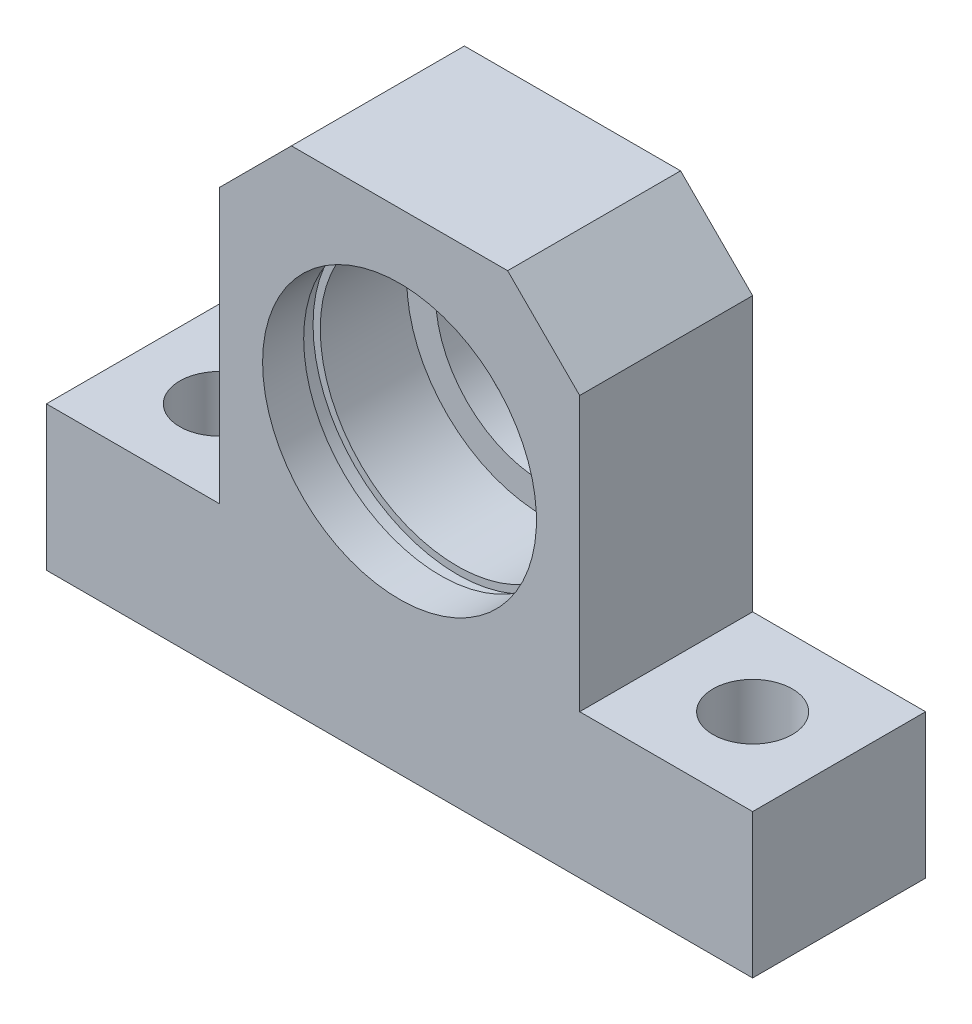
ISO-10303-21;
HEADER;
FILE_DESCRIPTION(('STEP AP214'),'2;1');
FILE_NAME('part.step','',(''),(''),'','','');
FILE_SCHEMA(('AUTOMOTIVE_DESIGN { 1 0 10303 214 1 1 1 1 }'));
ENDSEC;
DATA;
#1=APPLICATION_CONTEXT('core data for automotive mechanical design processes');
#2=APPLICATION_PROTOCOL_DEFINITION('international standard','automotive_design',2000,#1);
#3=PRODUCT_CONTEXT('',#1,'mechanical');
#4=PRODUCT('Part','Part','',(#3));
#5=PRODUCT_RELATED_PRODUCT_CATEGORY('part','',(#4));
#6=PRODUCT_DEFINITION_FORMATION('','',#4);
#7=PRODUCT_DEFINITION_CONTEXT('part definition',#1,'design');
#8=PRODUCT_DEFINITION('design','',#6,#7);
#9=PRODUCT_DEFINITION_SHAPE('','',#8);
#10=(LENGTH_UNIT() NAMED_UNIT(*) SI_UNIT(.MILLI.,.METRE.));
#11=(NAMED_UNIT(*) PLANE_ANGLE_UNIT() SI_UNIT($,.RADIAN.));
#12=(NAMED_UNIT(*) SI_UNIT($,.STERADIAN.) SOLID_ANGLE_UNIT());
#13=UNCERTAINTY_MEASURE_WITH_UNIT(LENGTH_MEASURE(1.E-05),#10,'distance_accuracy_value','');
#14=(GEOMETRIC_REPRESENTATION_CONTEXT(3) GLOBAL_UNCERTAINTY_ASSIGNED_CONTEXT((#13)) GLOBAL_UNIT_ASSIGNED_CONTEXT((#10,
#11,#12)) REPRESENTATION_CONTEXT('',''));
#15=CARTESIAN_POINT('',(0.,0.,0.));
#16=DIRECTION('',(0.,0.,1.));
#17=DIRECTION('',(1.,0.,0.));
#18=AXIS2_PLACEMENT_3D('',#15,#16,#17);
#19=CARTESIAN_POINT('',(-12.5,9.99999999999999,-12.));
#20=DIRECTION('',(-1.,0.,0.));
#21=DIRECTION('',(0.,-1.,0.));
#22=AXIS2_PLACEMENT_3D('',#19,#20,#21);
#23=PLANE('',#22);
#24=DIRECTION('',(0.,-1.,0.));
#25=VECTOR('',#24,1.);
#26=CARTESIAN_POINT('',(-12.5,9.99999999999999,0.));
#27=LINE('',#26,#25);
#28=CARTESIAN_POINT('',(-12.5,29.,0.));
#29=VERTEX_POINT('',#28);
#30=CARTESIAN_POINT('',(-12.5,9.99999999999999,0.));
#31=VERTEX_POINT('',#30);
#32=EDGE_CURVE('E147',#29,#31,#27,.T.);
#33=ORIENTED_EDGE('',*,*,#32,.F.);
#34=DIRECTION('',(0.,0.,-1.));
#35=VECTOR('',#34,1.);
#36=CARTESIAN_POINT('',(-12.5,29.,-12.));
#37=LINE('',#36,#35);
#38=CARTESIAN_POINT('',(-12.5,29.,-12.));
#39=VERTEX_POINT('',#38);
#40=EDGE_CURVE('E11',#29,#39,#37,.T.);
#41=ORIENTED_EDGE('',*,*,#40,.T.);
#42=DIRECTION('',(0.,-1.,0.));
#43=VECTOR('',#42,1.);
#44=CARTESIAN_POINT('',(-12.5,9.99999999999999,-12.));
#45=LINE('',#44,#43);
#46=CARTESIAN_POINT('',(-12.5,9.99999999999999,-12.));
#47=VERTEX_POINT('',#46);
#48=EDGE_CURVE('E109',#39,#47,#45,.T.);
#49=ORIENTED_EDGE('',*,*,#48,.T.);
#50=DIRECTION('',(0.,0.,1.));
#51=VECTOR('',#50,1.);
#52=CARTESIAN_POINT('',(-12.5,9.99999999999999,-12.));
#53=LINE('',#52,#51);
#54=EDGE_CURVE('E111',#47,#31,#53,.T.);
#55=ORIENTED_EDGE('',*,*,#54,.T.);
#56=EDGE_LOOP('',(#33,#41,#49,#55));
#57=FACE_BOUND('',#56,.T.);
#58=ADVANCED_FACE('F34',(#57),#23,.T.);
#59=CARTESIAN_POINT('',(-12.5,34.,-12.));
#60=DIRECTION('',(0.,1.,0.));
#61=DIRECTION('',(0.,0.,1.));
#62=AXIS2_PLACEMENT_3D('',#59,#60,#61);
#63=PLANE('',#62);
#64=DIRECTION('',(-1.,0.,0.));
#65=VECTOR('',#64,1.);
#66=CARTESIAN_POINT('',(-12.5,34.,0.));
#67=LINE('',#66,#65);
#68=CARTESIAN_POINT('',(7.49999999999997,34.,0.));
#69=VERTEX_POINT('',#68);
#70=CARTESIAN_POINT('',(-7.5,34.,0.));
#71=VERTEX_POINT('',#70);
#72=EDGE_CURVE('E115',#69,#71,#67,.T.);
#73=ORIENTED_EDGE('',*,*,#72,.F.);
#74=DIRECTION('',(0.,0.,-1.));
#75=VECTOR('',#74,1.);
#76=CARTESIAN_POINT('',(7.49999999999997,34.,-12.));
#77=LINE('',#76,#75);
#78=CARTESIAN_POINT('',(7.49999999999997,34.,-12.));
#79=VERTEX_POINT('',#78);
#80=EDGE_CURVE('E187',#69,#79,#77,.T.);
#81=ORIENTED_EDGE('',*,*,#80,.T.);
#82=DIRECTION('',(-1.,0.,0.));
#83=VECTOR('',#82,1.);
#84=CARTESIAN_POINT('',(-12.5,34.,-12.));
#85=LINE('',#84,#83);
#86=CARTESIAN_POINT('',(-7.50000000000001,34.,-12.));
#87=VERTEX_POINT('',#86);
#88=EDGE_CURVE('E123',#79,#87,#85,.T.);
#89=ORIENTED_EDGE('',*,*,#88,.T.);
#90=DIRECTION('',(0.,0.,1.));
#91=VECTOR('',#90,1.);
#92=CARTESIAN_POINT('',(-7.5,34.,-12.));
#93=LINE('',#92,#91);
#94=EDGE_CURVE('E184',#87,#71,#93,.T.);
#95=ORIENTED_EDGE('',*,*,#94,.T.);
#96=EDGE_LOOP('',(#73,#81,#89,#95));
#97=FACE_BOUND('',#96,.T.);
#98=ADVANCED_FACE('F203',(#97),#63,.T.);
#99=CARTESIAN_POINT('',(12.5,34.,-12.));
#100=DIRECTION('',(1.,0.,0.));
#101=DIRECTION('',(0.,1.,0.));
#102=AXIS2_PLACEMENT_3D('',#99,#100,#101);
#103=PLANE('',#102);
#104=DIRECTION('',(0.,1.,0.));
#105=VECTOR('',#104,1.);
#106=CARTESIAN_POINT('',(12.5,34.,-12.));
#107=LINE('',#106,#105);
#108=CARTESIAN_POINT('',(12.5,10.,-12.));
#109=VERTEX_POINT('',#108);
#110=CARTESIAN_POINT('',(12.5,29.,-12.));
#111=VERTEX_POINT('',#110);
#112=EDGE_CURVE('E143',#109,#111,#107,.T.);
#113=ORIENTED_EDGE('',*,*,#112,.T.);
#114=DIRECTION('',(0.,0.,1.));
#115=VECTOR('',#114,1.);
#116=CARTESIAN_POINT('',(12.5,29.,-12.));
#117=LINE('',#116,#115);
#118=CARTESIAN_POINT('',(12.5,29.,0.));
#119=VERTEX_POINT('',#118);
#120=EDGE_CURVE('E170',#111,#119,#117,.T.);
#121=ORIENTED_EDGE('',*,*,#120,.T.);
#122=DIRECTION('',(0.,1.,0.));
#123=VECTOR('',#122,1.);
#124=CARTESIAN_POINT('',(12.5,34.,0.));
#125=LINE('',#124,#123);
#126=CARTESIAN_POINT('',(12.5,10.,0.));
#127=VERTEX_POINT('',#126);
#128=EDGE_CURVE('E163',#127,#119,#125,.T.);
#129=ORIENTED_EDGE('',*,*,#128,.F.);
#130=DIRECTION('',(0.,0.,1.));
#131=VECTOR('',#130,1.);
#132=CARTESIAN_POINT('',(12.5,10.,-12.));
#133=LINE('',#132,#131);
#134=EDGE_CURVE('E168',#109,#127,#133,.T.);
#135=ORIENTED_EDGE('',*,*,#134,.F.);
#136=EDGE_LOOP('',(#113,#121,#129,#135));
#137=FACE_BOUND('',#136,.T.);
#138=ADVANCED_FACE('F196',(#137),#103,.T.);
#139=CARTESIAN_POINT('',(12.5,10.,-12.));
#140=DIRECTION('',(0.,1.,0.));
#141=DIRECTION('',(-1.,0.,0.));
#142=AXIS2_PLACEMENT_3D('',#139,#140,#141);
#143=PLANE('',#142);
#144=CARTESIAN_POINT('',(18.5,10.,-6.));
#145=DIRECTION('',(0.,1.,0.));
#146=DIRECTION('',(0.,0.,1.));
#147=AXIS2_PLACEMENT_3D('',#144,#145,#146);
#148=CIRCLE('',#147,2.74999999999999);
#149=CARTESIAN_POINT('',(18.5,10.,-3.25000000000001));
#150=VERTEX_POINT('',#149);
#151=EDGE_CURVE('E316',#150,#150,#148,.T.);
#152=ORIENTED_EDGE('',*,*,#151,.F.);
#153=EDGE_LOOP('',(#152));
#154=FACE_BOUND('',#153,.T.);
#155=DIRECTION('',(-1.,0.,0.));
#156=VECTOR('',#155,1.);
#157=CARTESIAN_POINT('',(12.5,10.,0.));
#158=LINE('',#157,#156);
#159=CARTESIAN_POINT('',(24.5,9.99999999999999,0.));
#160=VERTEX_POINT('',#159);
#161=EDGE_CURVE('E160',#160,#127,#158,.T.);
#162=ORIENTED_EDGE('',*,*,#161,.F.);
#163=DIRECTION('',(0.,0.,1.));
#164=VECTOR('',#163,1.);
#165=CARTESIAN_POINT('',(24.5,9.99999999999999,-12.));
#166=LINE('',#165,#164);
#167=CARTESIAN_POINT('',(24.5,9.99999999999999,-12.));
#168=VERTEX_POINT('',#167);
#169=EDGE_CURVE('E171',#168,#160,#166,.T.);
#170=ORIENTED_EDGE('',*,*,#169,.F.);
#171=DIRECTION('',(-1.,0.,0.));
#172=VECTOR('',#171,1.);
#173=CARTESIAN_POINT('',(12.5,10.,-12.));
#174=LINE('',#173,#172);
#175=EDGE_CURVE('E140',#168,#109,#174,.T.);
#176=ORIENTED_EDGE('',*,*,#175,.T.);
#177=ORIENTED_EDGE('',*,*,#134,.T.);
#178=EDGE_LOOP('',(#162,#170,#176,#177));
#179=FACE_BOUND('',#178,.T.);
#180=ADVANCED_FACE('F218',(#154,#179),#143,.T.);
#181=CARTESIAN_POINT('',(24.5,9.99999999999999,-12.));
#182=DIRECTION('',(1.,0.,0.));
#183=DIRECTION('',(0.,0.,-1.));
#184=AXIS2_PLACEMENT_3D('',#181,#182,#183);
#185=PLANE('',#184);
#186=DIRECTION('',(0.,1.,0.));
#187=VECTOR('',#186,1.);
#188=CARTESIAN_POINT('',(24.5,9.99999999999999,0.));
#189=LINE('',#188,#187);
#190=CARTESIAN_POINT('',(24.5,0.,0.));
#191=VERTEX_POINT('',#190);
#192=EDGE_CURVE('E157',#191,#160,#189,.T.);
#193=ORIENTED_EDGE('',*,*,#192,.F.);
#194=DIRECTION('',(0.,0.,1.));
#195=VECTOR('',#194,1.);
#196=CARTESIAN_POINT('',(24.5,0.,-12.));
#197=LINE('',#196,#195);
#198=CARTESIAN_POINT('',(24.5,0.,-12.));
#199=VERTEX_POINT('',#198);
#200=EDGE_CURVE('E173',#199,#191,#197,.T.);
#201=ORIENTED_EDGE('',*,*,#200,.F.);
#202=DIRECTION('',(0.,1.,0.));
#203=VECTOR('',#202,1.);
#204=CARTESIAN_POINT('',(24.5,9.99999999999999,-12.));
#205=LINE('',#204,#203);
#206=EDGE_CURVE('E137',#199,#168,#205,.T.);
#207=ORIENTED_EDGE('',*,*,#206,.T.);
#208=ORIENTED_EDGE('',*,*,#169,.T.);
#209=EDGE_LOOP('',(#193,#201,#207,#208));
#210=FACE_BOUND('',#209,.T.);
#211=ADVANCED_FACE('F215',(#210),#185,.T.);
#212=CARTESIAN_POINT('',(24.5,0.,-12.));
#213=DIRECTION('',(0.,-1.,0.));
#214=DIRECTION('',(0.,0.,-1.));
#215=AXIS2_PLACEMENT_3D('',#212,#213,#214);
#216=PLANE('',#215);
#217=CARTESIAN_POINT('',(-18.5,0.,-6.));
#218=DIRECTION('',(0.,1.,0.));
#219=DIRECTION('',(0.,0.,1.));
#220=AXIS2_PLACEMENT_3D('',#217,#218,#219);
#221=CIRCLE('',#220,2.75);
#222=CARTESIAN_POINT('',(-18.5,0.,-3.25));
#223=VERTEX_POINT('',#222);
#224=EDGE_CURVE('E319',#223,#223,#221,.T.);
#225=ORIENTED_EDGE('',*,*,#224,.T.);
#226=EDGE_LOOP('',(#225));
#227=FACE_BOUND('',#226,.T.);
#228=CARTESIAN_POINT('',(18.5,0.,-6.));
#229=DIRECTION('',(0.,1.,0.));
#230=DIRECTION('',(0.,0.,1.));
#231=AXIS2_PLACEMENT_3D('',#228,#229,#230);
#232=CIRCLE('',#231,2.75);
#233=CARTESIAN_POINT('',(18.5,0.,-3.25));
#234=VERTEX_POINT('',#233);
#235=EDGE_CURVE('E313',#234,#234,#232,.T.);
#236=ORIENTED_EDGE('',*,*,#235,.T.);
#237=EDGE_LOOP('',(#236));
#238=FACE_BOUND('',#237,.T.);
#239=DIRECTION('',(1.,0.,0.));
#240=VECTOR('',#239,1.);
#241=CARTESIAN_POINT('',(24.5,0.,0.));
#242=LINE('',#241,#240);
#243=CARTESIAN_POINT('',(-24.5,0.,0.));
#244=VERTEX_POINT('',#243);
#245=EDGE_CURVE('E154',#244,#191,#242,.T.);
#246=ORIENTED_EDGE('',*,*,#245,.F.);
#247=DIRECTION('',(0.,0.,1.));
#248=VECTOR('',#247,1.);
#249=CARTESIAN_POINT('',(-24.5,0.,-12.));
#250=LINE('',#249,#248);
#251=CARTESIAN_POINT('',(-24.5,0.,-12.));
#252=VERTEX_POINT('',#251);
#253=EDGE_CURVE('E175',#252,#244,#250,.T.);
#254=ORIENTED_EDGE('',*,*,#253,.F.);
#255=DIRECTION('',(1.,0.,0.));
#256=VECTOR('',#255,1.);
#257=CARTESIAN_POINT('',(24.5,0.,-12.));
#258=LINE('',#257,#256);
#259=EDGE_CURVE('E131',#252,#199,#258,.T.);
#260=ORIENTED_EDGE('',*,*,#259,.T.);
#261=ORIENTED_EDGE('',*,*,#200,.T.);
#262=EDGE_LOOP('',(#246,#254,#260,#261));
#263=FACE_BOUND('',#262,.T.);
#264=ADVANCED_FACE('F211',(#227,#238,#263),#216,.T.);
#265=CARTESIAN_POINT('',(-24.5,0.,-12.));
#266=DIRECTION('',(-1.,0.,0.));
#267=DIRECTION('',(0.,0.,1.));
#268=AXIS2_PLACEMENT_3D('',#265,#266,#267);
#269=PLANE('',#268);
#270=DIRECTION('',(0.,-1.,0.));
#271=VECTOR('',#270,1.);
#272=CARTESIAN_POINT('',(-24.5,0.,0.));
#273=LINE('',#272,#271);
#274=CARTESIAN_POINT('',(-24.5,9.99999999999999,0.));
#275=VERTEX_POINT('',#274);
#276=EDGE_CURVE('E151',#275,#244,#273,.T.);
#277=ORIENTED_EDGE('',*,*,#276,.F.);
#278=DIRECTION('',(0.,0.,1.));
#279=VECTOR('',#278,1.);
#280=CARTESIAN_POINT('',(-24.5,9.99999999999999,-12.));
#281=LINE('',#280,#279);
#282=CARTESIAN_POINT('',(-24.5,9.99999999999999,-12.));
#283=VERTEX_POINT('',#282);
#284=EDGE_CURVE('E122',#283,#275,#281,.T.);
#285=ORIENTED_EDGE('',*,*,#284,.F.);
#286=DIRECTION('',(0.,-1.,0.));
#287=VECTOR('',#286,1.);
#288=CARTESIAN_POINT('',(-24.5,0.,-12.));
#289=LINE('',#288,#287);
#290=EDGE_CURVE('E129',#283,#252,#289,.T.);
#291=ORIENTED_EDGE('',*,*,#290,.T.);
#292=ORIENTED_EDGE('',*,*,#253,.T.);
#293=EDGE_LOOP('',(#277,#285,#291,#292));
#294=FACE_BOUND('',#293,.T.);
#295=ADVANCED_FACE('F209',(#294),#269,.T.);
#296=CARTESIAN_POINT('',(-24.5,9.99999999999999,-12.));
#297=DIRECTION('',(0.,1.,0.));
#298=DIRECTION('',(0.,0.,1.));
#299=AXIS2_PLACEMENT_3D('',#296,#297,#298);
#300=PLANE('',#299);
#301=CARTESIAN_POINT('',(-18.5,10.,-6.));
#302=DIRECTION('',(0.,1.,0.));
#303=DIRECTION('',(0.,0.,1.));
#304=AXIS2_PLACEMENT_3D('',#301,#302,#303);
#305=CIRCLE('',#304,2.74999999999999);
#306=CARTESIAN_POINT('',(-18.5,10.,-3.25000000000001));
#307=VERTEX_POINT('',#306);
#308=EDGE_CURVE('E322',#307,#307,#305,.T.);
#309=ORIENTED_EDGE('',*,*,#308,.F.);
#310=EDGE_LOOP('',(#309));
#311=FACE_BOUND('',#310,.T.);
#312=DIRECTION('',(-1.,0.,0.));
#313=VECTOR('',#312,1.);
#314=CARTESIAN_POINT('',(-24.5,9.99999999999999,0.));
#315=LINE('',#314,#313);
#316=EDGE_CURVE('E121',#31,#275,#315,.T.);
#317=ORIENTED_EDGE('',*,*,#316,.F.);
#318=ORIENTED_EDGE('',*,*,#54,.F.);
#319=DIRECTION('',(-1.,0.,0.));
#320=VECTOR('',#319,1.);
#321=CARTESIAN_POINT('',(-24.5,9.99999999999999,-12.));
#322=LINE('',#321,#320);
#323=EDGE_CURVE('E114',#47,#283,#322,.T.);
#324=ORIENTED_EDGE('',*,*,#323,.T.);
#325=ORIENTED_EDGE('',*,*,#284,.T.);
#326=EDGE_LOOP('',(#317,#318,#324,#325));
#327=FACE_BOUND('',#326,.T.);
#328=ADVANCED_FACE('F119',(#311,#327),#300,.T.);
#329=CARTESIAN_POINT('',(0.,0.,-12.));
#330=DIRECTION('',(0.,0.,-1.));
#331=DIRECTION('',(-1.,0.,0.));
#332=AXIS2_PLACEMENT_3D('',#329,#330,#331);
#333=PLANE('',#332);
#334=CARTESIAN_POINT('',(0.,20.,-12.));
#335=DIRECTION('',(0.,0.,-1.));
#336=DIRECTION('',(-1.,0.,0.));
#337=AXIS2_PLACEMENT_3D('',#334,#335,#336);
#338=CIRCLE('',#337,7.5);
#339=CARTESIAN_POINT('',(-7.5,20.,-12.));
#340=VERTEX_POINT('',#339);
#341=EDGE_CURVE('E291',#340,#340,#338,.T.);
#342=ORIENTED_EDGE('',*,*,#341,.F.);
#343=EDGE_LOOP('',(#342));
#344=FACE_BOUND('',#343,.T.);
#345=ORIENTED_EDGE('',*,*,#88,.F.);
#346=DIRECTION('',(-0.707106781186549,0.707106781186546,0.));
#347=VECTOR('',#346,1.);
#348=CARTESIAN_POINT('',(20.75,20.7500000000001,-12.));
#349=LINE('',#348,#347);
#350=EDGE_CURVE('E42',#79,#111,#349,.F.);
#351=ORIENTED_EDGE('',*,*,#350,.T.);
#352=ORIENTED_EDGE('',*,*,#112,.F.);
#353=ORIENTED_EDGE('',*,*,#175,.F.);
#354=ORIENTED_EDGE('',*,*,#206,.F.);
#355=ORIENTED_EDGE('',*,*,#259,.F.);
#356=ORIENTED_EDGE('',*,*,#290,.F.);
#357=ORIENTED_EDGE('',*,*,#323,.F.);
#358=ORIENTED_EDGE('',*,*,#48,.F.);
#359=DIRECTION('',(-0.707106781186547,-0.707106781186548,0.));
#360=VECTOR('',#359,1.);
#361=CARTESIAN_POINT('',(-20.75,20.75,-12.));
#362=LINE('',#361,#360);
#363=EDGE_CURVE('E54',#39,#87,#362,.F.);
#364=ORIENTED_EDGE('',*,*,#363,.T.);
#365=EDGE_LOOP('',(#345,#351,#352,#353,#354,#355,#356,#357,#358,#364));
#366=FACE_BOUND('',#365,.T.);
#367=ADVANCED_FACE('F126',(#344,#366),#333,.T.);
#368=CARTESIAN_POINT('',(0.,0.,0.));
#369=DIRECTION('',(0.,0.,-1.));
#370=DIRECTION('',(-1.,0.,0.));
#371=AXIS2_PLACEMENT_3D('',#368,#369,#370);
#372=PLANE('',#371);
#373=CARTESIAN_POINT('',(0.,20.,0.));
#374=DIRECTION('',(0.,0.,-1.));
#375=DIRECTION('',(-1.,0.,0.));
#376=AXIS2_PLACEMENT_3D('',#373,#374,#375);
#377=CIRCLE('',#376,9.5);
#378=CARTESIAN_POINT('',(-9.5,20.,0.));
#379=VERTEX_POINT('',#378);
#380=EDGE_CURVE('E149',#379,#379,#377,.T.);
#381=ORIENTED_EDGE('',*,*,#380,.T.);
#382=EDGE_LOOP('',(#381));
#383=FACE_BOUND('',#382,.T.);
#384=ORIENTED_EDGE('',*,*,#128,.T.);
#385=DIRECTION('',(0.707106781186549,-0.707106781186546,0.));
#386=VECTOR('',#385,1.);
#387=CARTESIAN_POINT('',(12.5,29.,0.));
#388=LINE('',#387,#386);
#389=EDGE_CURVE('E182',#119,#69,#388,.F.);
#390=ORIENTED_EDGE('',*,*,#389,.T.);
#391=ORIENTED_EDGE('',*,*,#72,.T.);
#392=DIRECTION('',(0.707106781186547,0.707106781186548,0.));
#393=VECTOR('',#392,1.);
#394=CARTESIAN_POINT('',(-7.5,34.,0.));
#395=LINE('',#394,#393);
#396=EDGE_CURVE('E180',#71,#29,#395,.F.);
#397=ORIENTED_EDGE('',*,*,#396,.T.);
#398=ORIENTED_EDGE('',*,*,#32,.T.);
#399=ORIENTED_EDGE('',*,*,#316,.T.);
#400=ORIENTED_EDGE('',*,*,#276,.T.);
#401=ORIENTED_EDGE('',*,*,#245,.T.);
#402=ORIENTED_EDGE('',*,*,#192,.T.);
#403=ORIENTED_EDGE('',*,*,#161,.T.);
#404=EDGE_LOOP('',(#384,#390,#391,#397,#398,#399,#400,#401,#402,#403));
#405=FACE_BOUND('',#404,.T.);
#406=ADVANCED_FACE('F201',(#383,#405),#372,.F.);
#407=CARTESIAN_POINT('',(0.,20.,-12.));
#408=DIRECTION('',(0.,0.,-1.));
#409=DIRECTION('',(-1.,0.,0.));
#410=AXIS2_PLACEMENT_3D('',#407,#408,#409);
#411=CYLINDRICAL_SURFACE('',#410,9.5);
#412=ORIENTED_EDGE('',*,*,#380,.F.);
#413=EDGE_LOOP('',(#412));
#414=FACE_BOUND('',#413,.T.);
#415=CARTESIAN_POINT('',(0.,20.,-2.85));
#416=DIRECTION('',(0.,0.,-1.));
#417=DIRECTION('',(-1.,0.,0.));
#418=AXIS2_PLACEMENT_3D('',#415,#416,#417);
#419=CIRCLE('',#418,9.5);
#420=CARTESIAN_POINT('',(-9.5,20.,-2.85));
#421=VERTEX_POINT('',#420);
#422=EDGE_CURVE('E310',#421,#421,#419,.T.);
#423=ORIENTED_EDGE('',*,*,#422,.T.);
#424=EDGE_LOOP('',(#423));
#425=FACE_BOUND('',#424,.T.);
#426=ADVANCED_FACE('F277',(#414,#425),#411,.F.);
#427=CARTESIAN_POINT('',(0.,20.,-12.));
#428=DIRECTION('',(0.,0.,-1.));
#429=DIRECTION('',(-1.,0.,0.));
#430=AXIS2_PLACEMENT_3D('',#427,#428,#429);
#431=CYLINDRICAL_SURFACE('',#430,7.5);
#432=CARTESIAN_POINT('',(0.,20.,-10.));
#433=DIRECTION('',(0.,0.,-1.));
#434=DIRECTION('',(-1.,0.,0.));
#435=AXIS2_PLACEMENT_3D('',#432,#433,#434);
#436=CIRCLE('',#435,7.5);
#437=CARTESIAN_POINT('',(-7.5,20.,-10.));
#438=VERTEX_POINT('',#437);
#439=EDGE_CURVE('E293',#438,#438,#436,.T.);
#440=ORIENTED_EDGE('',*,*,#439,.F.);
#441=EDGE_LOOP('',(#440));
#442=FACE_BOUND('',#441,.T.);
#443=ORIENTED_EDGE('',*,*,#341,.T.);
#444=EDGE_LOOP('',(#443));
#445=FACE_BOUND('',#444,.T.);
#446=ADVANCED_FACE('F273',(#442,#445),#431,.F.);
#447=CARTESIAN_POINT('',(0.,29.5,-10.));
#448=DIRECTION('',(0.,0.,-1.));
#449=DIRECTION('',(-1.,0.,0.));
#450=AXIS2_PLACEMENT_3D('',#447,#448,#449);
#451=PLANE('',#450);
#452=CARTESIAN_POINT('',(0.,20.,-10.));
#453=DIRECTION('',(0.,0.,-1.));
#454=DIRECTION('',(-1.,0.,0.));
#455=AXIS2_PLACEMENT_3D('',#452,#453,#454);
#456=CIRCLE('',#455,9.5);
#457=CARTESIAN_POINT('',(-9.5,20.,-10.));
#458=VERTEX_POINT('',#457);
#459=EDGE_CURVE('E298',#458,#458,#456,.T.);
#460=ORIENTED_EDGE('',*,*,#459,.F.);
#461=EDGE_LOOP('',(#460));
#462=FACE_BOUND('',#461,.T.);
#463=ORIENTED_EDGE('',*,*,#439,.T.);
#464=EDGE_LOOP('',(#463));
#465=FACE_BOUND('',#464,.T.);
#466=ADVANCED_FACE('F269',(#462,#465),#451,.F.);
#467=CARTESIAN_POINT('',(0.,20.,-12.));
#468=DIRECTION('',(0.,0.,-1.));
#469=DIRECTION('',(-1.,0.,0.));
#470=AXIS2_PLACEMENT_3D('',#467,#468,#469);
#471=CYLINDRICAL_SURFACE('',#470,9.5);
#472=CARTESIAN_POINT('',(0.,20.,-4.));
#473=DIRECTION('',(0.,0.,-1.));
#474=DIRECTION('',(-1.,0.,0.));
#475=AXIS2_PLACEMENT_3D('',#472,#473,#474);
#476=CIRCLE('',#475,9.5);
#477=CARTESIAN_POINT('',(-9.5,20.,-4.));
#478=VERTEX_POINT('',#477);
#479=EDGE_CURVE('E301',#478,#478,#476,.T.);
#480=ORIENTED_EDGE('',*,*,#479,.F.);
#481=EDGE_LOOP('',(#480));
#482=FACE_BOUND('',#481,.T.);
#483=ORIENTED_EDGE('',*,*,#459,.T.);
#484=EDGE_LOOP('',(#483));
#485=FACE_BOUND('',#484,.T.);
#486=ADVANCED_FACE('F265',(#482,#485),#471,.F.);
#487=CARTESIAN_POINT('',(0.,30.,-4.));
#488=DIRECTION('',(0.,0.,-1.));
#489=DIRECTION('',(-1.,0.,0.));
#490=AXIS2_PLACEMENT_3D('',#487,#488,#489);
#491=PLANE('',#490);
#492=CARTESIAN_POINT('',(0.,20.,-4.));
#493=DIRECTION('',(0.,0.,-1.));
#494=DIRECTION('',(-1.,0.,0.));
#495=AXIS2_PLACEMENT_3D('',#492,#493,#494);
#496=CIRCLE('',#495,10.);
#497=CARTESIAN_POINT('',(-10.,20.,-4.));
#498=VERTEX_POINT('',#497);
#499=EDGE_CURVE('E304',#498,#498,#496,.T.);
#500=ORIENTED_EDGE('',*,*,#499,.F.);
#501=EDGE_LOOP('',(#500));
#502=FACE_BOUND('',#501,.T.);
#503=ORIENTED_EDGE('',*,*,#479,.T.);
#504=EDGE_LOOP('',(#503));
#505=FACE_BOUND('',#504,.T.);
#506=ADVANCED_FACE('F261',(#502,#505),#491,.F.);
#507=CARTESIAN_POINT('',(0.,20.,-12.));
#508=DIRECTION('',(0.,0.,-1.));
#509=DIRECTION('',(-1.,0.,0.));
#510=AXIS2_PLACEMENT_3D('',#507,#508,#509);
#511=CYLINDRICAL_SURFACE('',#510,10.);
#512=CARTESIAN_POINT('',(0.,20.,-2.85));
#513=DIRECTION('',(0.,0.,-1.));
#514=DIRECTION('',(-1.,0.,0.));
#515=AXIS2_PLACEMENT_3D('',#512,#513,#514);
#516=CIRCLE('',#515,10.);
#517=CARTESIAN_POINT('',(-10.,20.,-2.85));
#518=VERTEX_POINT('',#517);
#519=EDGE_CURVE('E307',#518,#518,#516,.T.);
#520=ORIENTED_EDGE('',*,*,#519,.F.);
#521=EDGE_LOOP('',(#520));
#522=FACE_BOUND('',#521,.T.);
#523=ORIENTED_EDGE('',*,*,#499,.T.);
#524=EDGE_LOOP('',(#523));
#525=FACE_BOUND('',#524,.T.);
#526=ADVANCED_FACE('F257',(#522,#525),#511,.F.);
#527=CARTESIAN_POINT('',(0.,29.5,-2.85));
#528=DIRECTION('',(0.,0.,1.));
#529=DIRECTION('',(1.,0.,0.));
#530=AXIS2_PLACEMENT_3D('',#527,#528,#529);
#531=PLANE('',#530);
#532=ORIENTED_EDGE('',*,*,#422,.F.);
#533=EDGE_LOOP('',(#532));
#534=FACE_BOUND('',#533,.T.);
#535=ORIENTED_EDGE('',*,*,#519,.T.);
#536=EDGE_LOOP('',(#535));
#537=FACE_BOUND('',#536,.T.);
#538=ADVANCED_FACE('F249',(#534,#537),#531,.F.);
#539=CARTESIAN_POINT('',(18.5,9.99999999999999,-6.));
#540=DIRECTION('',(0.,1.,0.));
#541=DIRECTION('',(0.,0.,1.));
#542=AXIS2_PLACEMENT_3D('',#539,#540,#541);
#543=CYLINDRICAL_SURFACE('',#542,2.74999999999999);
#544=ORIENTED_EDGE('',*,*,#235,.F.);
#545=EDGE_LOOP('',(#544));
#546=FACE_BOUND('',#545,.T.);
#547=ORIENTED_EDGE('',*,*,#151,.T.);
#548=EDGE_LOOP('',(#547));
#549=FACE_BOUND('',#548,.T.);
#550=ADVANCED_FACE('F243',(#546,#549),#543,.F.);
#551=CARTESIAN_POINT('',(-18.5,9.99999999999999,-6.));
#552=DIRECTION('',(0.,1.,0.));
#553=DIRECTION('',(0.,0.,1.));
#554=AXIS2_PLACEMENT_3D('',#551,#552,#553);
#555=CYLINDRICAL_SURFACE('',#554,2.74999999999999);
#556=ORIENTED_EDGE('',*,*,#224,.F.);
#557=EDGE_LOOP('',(#556));
#558=FACE_BOUND('',#557,.T.);
#559=ORIENTED_EDGE('',*,*,#308,.T.);
#560=EDGE_LOOP('',(#559));
#561=FACE_BOUND('',#560,.T.);
#562=ADVANCED_FACE('F238',(#558,#561),#555,.F.);
#563=CARTESIAN_POINT('',(12.5,29.,-12.));
#564=DIRECTION('',(-0.707106781186545,-0.707106781186549,0.));
#565=DIRECTION('',(0.,0.,1.));
#566=AXIS2_PLACEMENT_3D('',#563,#564,#565);
#567=PLANE('',#566);
#568=ORIENTED_EDGE('',*,*,#350,.F.);
#569=ORIENTED_EDGE('',*,*,#80,.F.);
#570=ORIENTED_EDGE('',*,*,#389,.F.);
#571=ORIENTED_EDGE('',*,*,#120,.F.);
#572=EDGE_LOOP('',(#568,#569,#570,#571));
#573=FACE_BOUND('',#572,.T.);
#574=ADVANCED_FACE('F198',(#573),#567,.F.);
#575=CARTESIAN_POINT('',(-7.5,34.,-12.));
#576=DIRECTION('',(0.707106781186548,-0.707106781186547,0.));
#577=DIRECTION('',(0.,0.,1.));
#578=AXIS2_PLACEMENT_3D('',#575,#576,#577);
#579=PLANE('',#578);
#580=ORIENTED_EDGE('',*,*,#363,.F.);
#581=ORIENTED_EDGE('',*,*,#40,.F.);
#582=ORIENTED_EDGE('',*,*,#396,.F.);
#583=ORIENTED_EDGE('',*,*,#94,.F.);
#584=EDGE_LOOP('',(#580,#581,#582,#583));
#585=FACE_BOUND('',#584,.T.);
#586=ADVANCED_FACE('F36',(#585),#579,.F.);
#587=CLOSED_SHELL('',(#58,#98,#138,#180,#211,#264,#295,#328,#367,#406,#426,#446,#466,#486,#506,
#526,#538,#550,#562,#574,#586));
#588=MANIFOLD_SOLID_BREP('B2',#587);
#589=ADVANCED_BREP_SHAPE_REPRESENTATION('',(#18,#588),#14);
#590=SHAPE_DEFINITION_REPRESENTATION(#9,#589);
ENDSEC;
END-ISO-10303-21;
